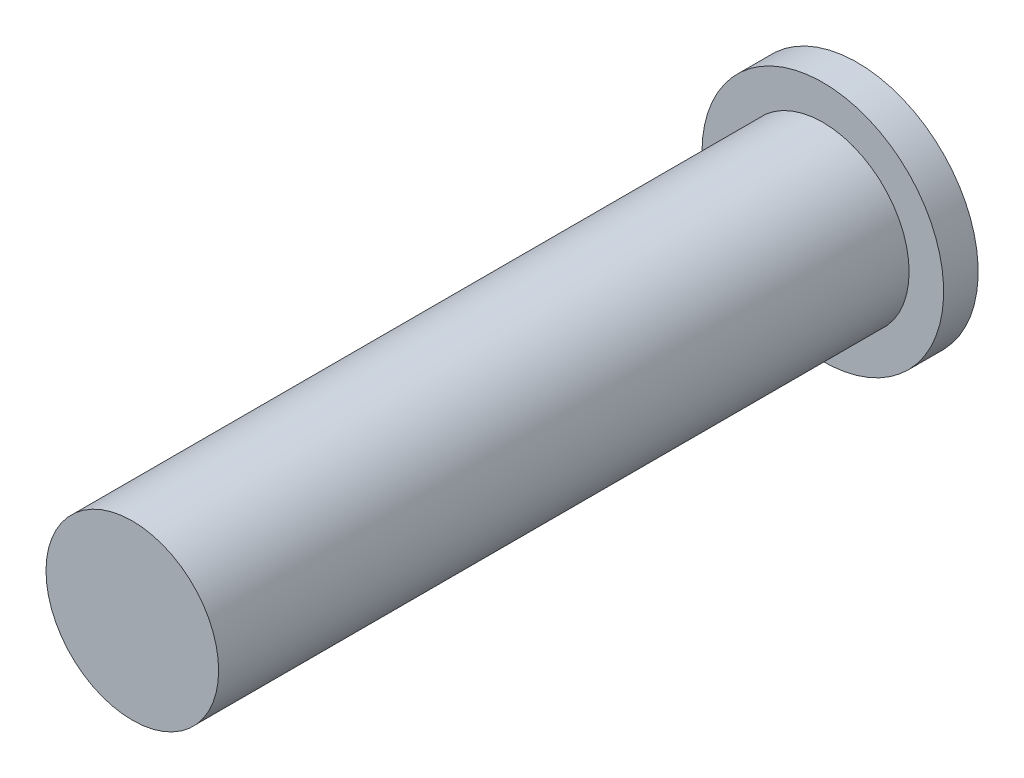
ISO-10303-21;
HEADER;
FILE_DESCRIPTION(('STEP AP214'),'2;1');
FILE_NAME('part.step','',(''),(''),'','','');
FILE_SCHEMA(('AUTOMOTIVE_DESIGN { 1 0 10303 214 1 1 1 1 }'));
ENDSEC;
DATA;
#1=APPLICATION_CONTEXT('core data for automotive mechanical design processes');
#2=APPLICATION_PROTOCOL_DEFINITION('international standard','automotive_design',2000,#1);
#3=PRODUCT_CONTEXT('',#1,'mechanical');
#4=PRODUCT('Part','Part','',(#3));
#5=PRODUCT_RELATED_PRODUCT_CATEGORY('part','',(#4));
#6=PRODUCT_DEFINITION_FORMATION('','',#4);
#7=PRODUCT_DEFINITION_CONTEXT('part definition',#1,'design');
#8=PRODUCT_DEFINITION('design','',#6,#7);
#9=PRODUCT_DEFINITION_SHAPE('','',#8);
#10=(LENGTH_UNIT() NAMED_UNIT(*) SI_UNIT(.MILLI.,.METRE.));
#11=(NAMED_UNIT(*) PLANE_ANGLE_UNIT() SI_UNIT($,.RADIAN.));
#12=(NAMED_UNIT(*) SI_UNIT($,.STERADIAN.) SOLID_ANGLE_UNIT());
#13=UNCERTAINTY_MEASURE_WITH_UNIT(LENGTH_MEASURE(1.E-05),#10,'distance_accuracy_value','');
#14=(GEOMETRIC_REPRESENTATION_CONTEXT(3) GLOBAL_UNCERTAINTY_ASSIGNED_CONTEXT((#13)) GLOBAL_UNIT_ASSIGNED_CONTEXT((#10,
#11,#12)) REPRESENTATION_CONTEXT('',''));
#15=CARTESIAN_POINT('',(0.,0.,0.));
#16=DIRECTION('',(0.,0.,1.));
#17=DIRECTION('',(1.,0.,0.));
#18=AXIS2_PLACEMENT_3D('',#15,#16,#17);
#19=CARTESIAN_POINT('',(0.,0.,40.));
#20=DIRECTION('',(0.,0.,-1.));
#21=DIRECTION('',(-1.,0.,0.));
#22=AXIS2_PLACEMENT_3D('',#19,#20,#21);
#23=CYLINDRICAL_SURFACE('',#22,5.);
#24=CARTESIAN_POINT('',(0.,0.,40.));
#25=DIRECTION('',(0.,0.,1.));
#26=DIRECTION('',(1.,0.,0.));
#27=AXIS2_PLACEMENT_3D('',#24,#25,#26);
#28=CIRCLE('',#27,5.);
#29=CARTESIAN_POINT('',(5.,0.,40.));
#30=VERTEX_POINT('',#29);
#31=EDGE_CURVE('E10',#30,#30,#28,.T.);
#32=ORIENTED_EDGE('',*,*,#31,.F.);
#33=EDGE_LOOP('',(#32));
#34=FACE_BOUND('',#33,.T.);
#35=CARTESIAN_POINT('',(0.,0.,0.));
#36=DIRECTION('',(0.,0.,1.));
#37=DIRECTION('',(1.,0.,0.));
#38=AXIS2_PLACEMENT_3D('',#35,#36,#37);
#39=CIRCLE('',#38,5.);
#40=CARTESIAN_POINT('',(5.,0.,0.));
#41=VERTEX_POINT('',#40);
#42=EDGE_CURVE('E36',#41,#41,#39,.T.);
#43=ORIENTED_EDGE('',*,*,#42,.T.);
#44=EDGE_LOOP('',(#43));
#45=FACE_BOUND('',#44,.T.);
#46=ADVANCED_FACE('F33',(#34,#45),#23,.T.);
#47=CARTESIAN_POINT('',(0.,0.,40.));
#48=DIRECTION('',(0.,0.,1.));
#49=DIRECTION('',(1.,0.,0.));
#50=AXIS2_PLACEMENT_3D('',#47,#48,#49);
#51=PLANE('',#50);
#52=ORIENTED_EDGE('',*,*,#31,.T.);
#53=EDGE_LOOP('',(#52));
#54=FACE_BOUND('',#53,.T.);
#55=ADVANCED_FACE('F56',(#54),#51,.T.);
#56=CARTESIAN_POINT('',(0.,0.,-2.));
#57=DIRECTION('',(0.,0.,1.));
#58=DIRECTION('',(1.,0.,0.));
#59=AXIS2_PLACEMENT_3D('',#56,#57,#58);
#60=CYLINDRICAL_SURFACE('',#59,7.);
#61=CARTESIAN_POINT('',(0.,0.,-2.));
#62=DIRECTION('',(0.,0.,-1.));
#63=DIRECTION('',(-1.,0.,0.));
#64=AXIS2_PLACEMENT_3D('',#61,#62,#63);
#65=CIRCLE('',#64,7.);
#66=CARTESIAN_POINT('',(-7.,0.,-2.));
#67=VERTEX_POINT('',#66);
#68=EDGE_CURVE('E43',#67,#67,#65,.T.);
#69=ORIENTED_EDGE('',*,*,#68,.F.);
#70=EDGE_LOOP('',(#69));
#71=FACE_BOUND('',#70,.T.);
#72=CARTESIAN_POINT('',(0.,0.,0.));
#73=DIRECTION('',(0.,0.,-1.));
#74=DIRECTION('',(-1.,0.,0.));
#75=AXIS2_PLACEMENT_3D('',#72,#73,#74);
#76=CIRCLE('',#75,7.);
#77=CARTESIAN_POINT('',(-7.,0.,0.));
#78=VERTEX_POINT('',#77);
#79=EDGE_CURVE('E45',#78,#78,#76,.T.);
#80=ORIENTED_EDGE('',*,*,#79,.T.);
#81=EDGE_LOOP('',(#80));
#82=FACE_BOUND('',#81,.T.);
#83=ADVANCED_FACE('F53',(#71,#82),#60,.T.);
#84=CARTESIAN_POINT('',(0.,0.,-2.));
#85=DIRECTION('',(0.,0.,-1.));
#86=DIRECTION('',(-1.,0.,0.));
#87=AXIS2_PLACEMENT_3D('',#84,#85,#86);
#88=PLANE('',#87);
#89=ORIENTED_EDGE('',*,*,#68,.T.);
#90=EDGE_LOOP('',(#89));
#91=FACE_BOUND('',#90,.T.);
#92=ADVANCED_FACE('F51',(#91),#88,.T.);
#93=CARTESIAN_POINT('',(0.,0.,0.));
#94=DIRECTION('',(0.,0.,-1.));
#95=DIRECTION('',(-1.,0.,0.));
#96=AXIS2_PLACEMENT_3D('',#93,#94,#95);
#97=PLANE('',#96);
#98=ORIENTED_EDGE('',*,*,#42,.F.);
#99=EDGE_LOOP('',(#98));
#100=FACE_BOUND('',#99,.T.);
#101=ORIENTED_EDGE('',*,*,#79,.F.);
#102=EDGE_LOOP('',(#101));
#103=FACE_BOUND('',#102,.T.);
#104=ADVANCED_FACE('F60',(#100,#103),#97,.F.);
#105=CLOSED_SHELL('',(#46,#55,#83,#92,#104));
#106=MANIFOLD_SOLID_BREP('B2',#105);
#107=ADVANCED_BREP_SHAPE_REPRESENTATION('',(#18,#106),#14);
#108=SHAPE_DEFINITION_REPRESENTATION(#9,#107);
ENDSEC;
END-ISO-10303-21;
